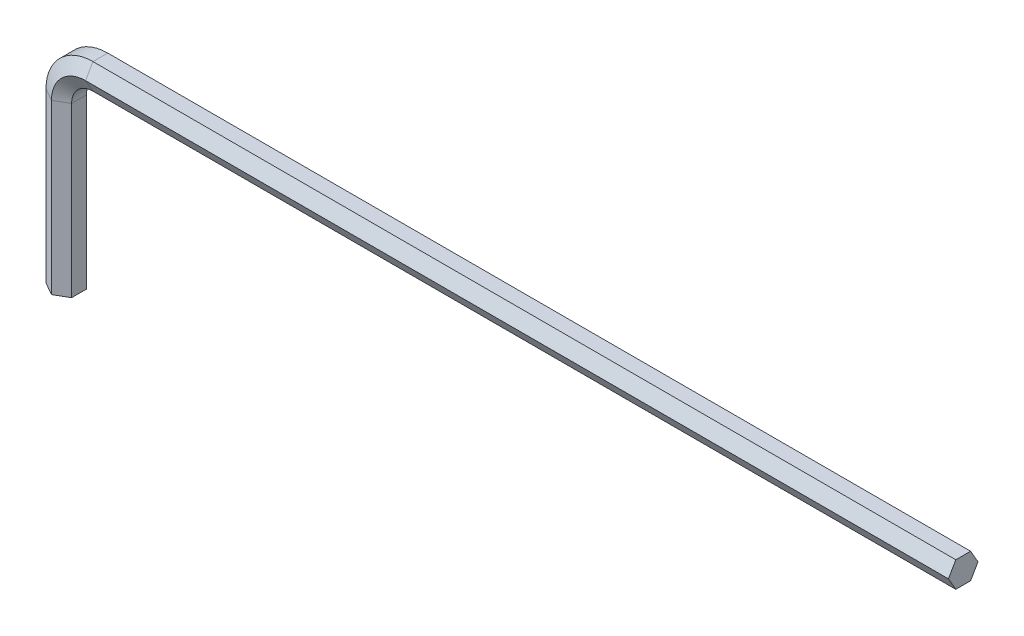
ISO-10303-21;
HEADER;
FILE_DESCRIPTION(('STEP AP214'),'2;1');
FILE_NAME('part.step','',(''),(''),'','','');
FILE_SCHEMA(('AUTOMOTIVE_DESIGN { 1 0 10303 214 1 1 1 1 }'));
ENDSEC;
DATA;
#1=APPLICATION_CONTEXT('core data for automotive mechanical design processes');
#2=APPLICATION_PROTOCOL_DEFINITION('international standard','automotive_design',2000,#1);
#3=PRODUCT_CONTEXT('',#1,'mechanical');
#4=PRODUCT('Part','Part','',(#3));
#5=PRODUCT_RELATED_PRODUCT_CATEGORY('part','',(#4));
#6=PRODUCT_DEFINITION_FORMATION('','',#4);
#7=PRODUCT_DEFINITION_CONTEXT('part definition',#1,'design');
#8=PRODUCT_DEFINITION('design','',#6,#7);
#9=PRODUCT_DEFINITION_SHAPE('','',#8);
#10=(LENGTH_UNIT() NAMED_UNIT(*) SI_UNIT(.MILLI.,.METRE.));
#11=(NAMED_UNIT(*) PLANE_ANGLE_UNIT() SI_UNIT($,.RADIAN.));
#12=(NAMED_UNIT(*) SI_UNIT($,.STERADIAN.) SOLID_ANGLE_UNIT());
#13=UNCERTAINTY_MEASURE_WITH_UNIT(LENGTH_MEASURE(1.E-05),#10,'distance_accuracy_value','');
#14=(GEOMETRIC_REPRESENTATION_CONTEXT(3) GLOBAL_UNCERTAINTY_ASSIGNED_CONTEXT((#13)) GLOBAL_UNIT_ASSIGNED_CONTEXT((#10,
#11,#12)) REPRESENTATION_CONTEXT('',''));
#15=CARTESIAN_POINT('',(0.,0.,0.));
#16=DIRECTION('',(0.,0.,1.));
#17=DIRECTION('',(1.,0.,0.));
#18=AXIS2_PLACEMENT_3D('',#15,#16,#17);
#19=CARTESIAN_POINT('',(105.06,0.,0.));
#20=DIRECTION('',(-1.,0.,0.));
#21=DIRECTION('',(0.,0.,1.));
#22=AXIS2_PLACEMENT_3D('',#19,#20,#21);
#23=PLANE('',#22);
#24=DIRECTION('',(0.,0.,-1.));
#25=VECTOR('',#24,1.);
#26=CARTESIAN_POINT('',(105.06,1.5,0.86602540378444));
#27=LINE('',#26,#25);
#28=CARTESIAN_POINT('',(105.06,1.5,0.86602540378444));
#29=VERTEX_POINT('',#28);
#30=CARTESIAN_POINT('',(105.06,1.5,-0.866025403784439));
#31=VERTEX_POINT('',#30);
#32=EDGE_CURVE('E10',#29,#31,#27,.T.);
#33=ORIENTED_EDGE('',*,*,#32,.F.);
#34=DIRECTION('',(0.,0.866025403784439,-0.5));
#35=VECTOR('',#34,1.);
#36=CARTESIAN_POINT('',(105.06,0.,1.73205080756888));
#37=LINE('',#36,#35);
#38=CARTESIAN_POINT('',(105.06,0.,1.73205080756888));
#39=VERTEX_POINT('',#38);
#40=EDGE_CURVE('E260',#39,#29,#37,.T.);
#41=ORIENTED_EDGE('',*,*,#40,.F.);
#42=DIRECTION('',(0.,0.866025403784439,0.5));
#43=VECTOR('',#42,1.);
#44=CARTESIAN_POINT('',(105.06,-1.5,0.866025403784439));
#45=LINE('',#44,#43);
#46=CARTESIAN_POINT('',(105.06,-1.5,0.866025403784439));
#47=VERTEX_POINT('',#46);
#48=EDGE_CURVE('E245',#47,#39,#45,.T.);
#49=ORIENTED_EDGE('',*,*,#48,.F.);
#50=DIRECTION('',(0.,0.,1.));
#51=VECTOR('',#50,1.);
#52=CARTESIAN_POINT('',(105.06,-1.5,-0.866025403784439));
#53=LINE('',#52,#51);
#54=CARTESIAN_POINT('',(105.06,-1.5,-0.866025403784439));
#55=VERTEX_POINT('',#54);
#56=EDGE_CURVE('E275',#55,#47,#53,.T.);
#57=ORIENTED_EDGE('',*,*,#56,.F.);
#58=DIRECTION('',(0.,-0.866025403784439,0.5));
#59=VECTOR('',#58,1.);
#60=CARTESIAN_POINT('',(105.06,0.,-1.73205080756887));
#61=LINE('',#60,#59);
#62=CARTESIAN_POINT('',(105.06,0.,-1.73205080756887));
#63=VERTEX_POINT('',#62);
#64=EDGE_CURVE('E281',#63,#55,#61,.T.);
#65=ORIENTED_EDGE('',*,*,#64,.F.);
#66=DIRECTION('',(0.,-0.866025403784439,-0.5));
#67=VECTOR('',#66,1.);
#68=CARTESIAN_POINT('',(105.06,1.5,-0.866025403784439));
#69=LINE('',#68,#67);
#70=EDGE_CURVE('E24',#31,#63,#69,.T.);
#71=ORIENTED_EDGE('',*,*,#70,.F.);
#72=EDGE_LOOP('',(#33,#41,#49,#57,#65,#71));
#73=FACE_BOUND('',#72,.T.);
#74=ADVANCED_FACE('F16',(#73),#23,.F.);
#75=CARTESIAN_POINT('',(0.,-23.7,0.));
#76=DIRECTION('',(0.,-1.,0.));
#77=DIRECTION('',(0.,0.,-1.));
#78=AXIS2_PLACEMENT_3D('',#75,#76,#77);
#79=PLANE('',#78);
#80=DIRECTION('',(0.,0.,-1.));
#81=VECTOR('',#80,1.);
#82=CARTESIAN_POINT('',(-1.5,-23.7,0.86602540378444));
#83=LINE('',#82,#81);
#84=CARTESIAN_POINT('',(-1.5,-23.7,0.86602540378444));
#85=VERTEX_POINT('',#84);
#86=CARTESIAN_POINT('',(-1.5,-23.7,-0.866025403784439));
#87=VERTEX_POINT('',#86);
#88=EDGE_CURVE('E213',#85,#87,#83,.T.);
#89=ORIENTED_EDGE('',*,*,#88,.T.);
#90=DIRECTION('',(0.866025403784439,0.,-0.5));
#91=VECTOR('',#90,1.);
#92=CARTESIAN_POINT('',(-1.5,-23.7,-0.866025403784439));
#93=LINE('',#92,#91);
#94=CARTESIAN_POINT('',(0.,-23.7,-1.73205080756887));
#95=VERTEX_POINT('',#94);
#96=EDGE_CURVE('E177',#87,#95,#93,.T.);
#97=ORIENTED_EDGE('',*,*,#96,.T.);
#98=DIRECTION('',(0.866025403784439,0.,0.5));
#99=VECTOR('',#98,1.);
#100=CARTESIAN_POINT('',(0.,-23.7,-1.73205080756887));
#101=LINE('',#100,#99);
#102=CARTESIAN_POINT('',(1.5,-23.7,-0.866025403784439));
#103=VERTEX_POINT('',#102);
#104=EDGE_CURVE('E186',#95,#103,#101,.T.);
#105=ORIENTED_EDGE('',*,*,#104,.T.);
#106=DIRECTION('',(0.,0.,1.));
#107=VECTOR('',#106,1.);
#108=CARTESIAN_POINT('',(1.5,-23.7,-0.866025403784439));
#109=LINE('',#108,#107);
#110=CARTESIAN_POINT('',(1.5,-23.7,0.866025403784439));
#111=VERTEX_POINT('',#110);
#112=EDGE_CURVE('E141',#103,#111,#109,.T.);
#113=ORIENTED_EDGE('',*,*,#112,.T.);
#114=DIRECTION('',(-0.866025403784439,0.,0.5));
#115=VECTOR('',#114,1.);
#116=CARTESIAN_POINT('',(1.5,-23.7,0.866025403784439));
#117=LINE('',#116,#115);
#118=CARTESIAN_POINT('',(0.,-23.7,1.73205080756888));
#119=VERTEX_POINT('',#118);
#120=EDGE_CURVE('E135',#111,#119,#117,.T.);
#121=ORIENTED_EDGE('',*,*,#120,.T.);
#122=DIRECTION('',(-0.866025403784439,0.,-0.5));
#123=VECTOR('',#122,1.);
#124=CARTESIAN_POINT('',(0.,-23.7,1.73205080756888));
#125=LINE('',#124,#123);
#126=EDGE_CURVE('E139',#119,#85,#125,.T.);
#127=ORIENTED_EDGE('',*,*,#126,.T.);
#128=EDGE_LOOP('',(#89,#97,#105,#113,#121,#127));
#129=FACE_BOUND('',#128,.T.);
#130=ADVANCED_FACE('F137',(#129),#79,.T.);
#131=CARTESIAN_POINT('',(105.06,1.5,0.86602540378444));
#132=DIRECTION('',(0.,1.,0.));
#133=DIRECTION('',(0.,0.,-1.));
#134=AXIS2_PLACEMENT_3D('',#131,#132,#133);
#135=PLANE('',#134);
#136=DIRECTION('',(-1.,0.,0.));
#137=VECTOR('',#136,1.);
#138=CARTESIAN_POINT('',(105.06,1.5,-0.866025403784439));
#139=LINE('',#138,#137);
#140=CARTESIAN_POINT('',(4.,1.5,-0.866025403784439));
#141=VERTEX_POINT('',#140);
#142=EDGE_CURVE('E284',#31,#141,#139,.T.);
#143=ORIENTED_EDGE('',*,*,#142,.T.);
#144=DIRECTION('',(0.,0.,-1.));
#145=VECTOR('',#144,1.);
#146=CARTESIAN_POINT('',(4.,1.5,0.86602540378444));
#147=LINE('',#146,#145);
#148=CARTESIAN_POINT('',(4.,1.5,0.86602540378444));
#149=VERTEX_POINT('',#148);
#150=EDGE_CURVE('E257',#149,#141,#147,.T.);
#151=ORIENTED_EDGE('',*,*,#150,.F.);
#152=DIRECTION('',(-1.,0.,0.));
#153=VECTOR('',#152,1.);
#154=CARTESIAN_POINT('',(105.06,1.5,0.86602540378444));
#155=LINE('',#154,#153);
#156=EDGE_CURVE('E246',#29,#149,#155,.T.);
#157=ORIENTED_EDGE('',*,*,#156,.F.);
#158=ORIENTED_EDGE('',*,*,#32,.T.);
#159=EDGE_LOOP('',(#143,#151,#157,#158));
#160=FACE_BOUND('',#159,.T.);
#161=ADVANCED_FACE('F667',(#160),#135,.T.);
#162=CARTESIAN_POINT('',(105.06,1.5,-0.866025403784439));
#163=DIRECTION('',(0.,0.5,-0.866025403784439));
#164=DIRECTION('',(-1.,0.,0.));
#165=AXIS2_PLACEMENT_3D('',#162,#163,#164);
#166=PLANE('',#165);
#167=DIRECTION('',(-1.,0.,0.));
#168=VECTOR('',#167,1.);
#169=CARTESIAN_POINT('',(105.06,0.,-1.73205080756887));
#170=LINE('',#169,#168);
#171=CARTESIAN_POINT('',(4.,0.,-1.73205080756887));
#172=VERTEX_POINT('',#171);
#173=EDGE_CURVE('E278',#63,#172,#170,.T.);
#174=ORIENTED_EDGE('',*,*,#173,.T.);
#175=DIRECTION('',(0.,-0.866025403784439,-0.5));
#176=VECTOR('',#175,1.);
#177=CARTESIAN_POINT('',(4.,1.5,-0.866025403784439));
#178=LINE('',#177,#176);
#179=EDGE_CURVE('E253',#141,#172,#178,.T.);
#180=ORIENTED_EDGE('',*,*,#179,.F.);
#181=ORIENTED_EDGE('',*,*,#142,.F.);
#182=ORIENTED_EDGE('',*,*,#70,.T.);
#183=EDGE_LOOP('',(#174,#180,#181,#182));
#184=FACE_BOUND('',#183,.T.);
#185=ADVANCED_FACE('F677',(#184),#166,.T.);
#186=CARTESIAN_POINT('',(105.06,0.,-1.73205080756887));
#187=DIRECTION('',(0.,-0.5,-0.866025403784439));
#188=DIRECTION('',(0.,-0.866025403784439,0.5));
#189=AXIS2_PLACEMENT_3D('',#186,#187,#188);
#190=PLANE('',#189);
#191=DIRECTION('',(-1.,0.,0.));
#192=VECTOR('',#191,1.);
#193=CARTESIAN_POINT('',(105.06,-1.5,-0.866025403784439));
#194=LINE('',#193,#192);
#195=CARTESIAN_POINT('',(4.,-1.5,-0.866025403784439));
#196=VERTEX_POINT('',#195);
#197=EDGE_CURVE('E272',#55,#196,#194,.T.);
#198=ORIENTED_EDGE('',*,*,#197,.T.);
#199=DIRECTION('',(0.,-0.866025403784439,0.5));
#200=VECTOR('',#199,1.);
#201=CARTESIAN_POINT('',(4.,0.,-1.73205080756887));
#202=LINE('',#201,#200);
#203=EDGE_CURVE('E241',#172,#196,#202,.T.);
#204=ORIENTED_EDGE('',*,*,#203,.F.);
#205=ORIENTED_EDGE('',*,*,#173,.F.);
#206=ORIENTED_EDGE('',*,*,#64,.T.);
#207=EDGE_LOOP('',(#198,#204,#205,#206));
#208=FACE_BOUND('',#207,.T.);
#209=ADVANCED_FACE('F542',(#208),#190,.T.);
#210=CARTESIAN_POINT('',(105.06,-1.5,-0.866025403784439));
#211=DIRECTION('',(0.,-1.,0.));
#212=DIRECTION('',(0.,0.,-1.));
#213=AXIS2_PLACEMENT_3D('',#210,#211,#212);
#214=PLANE('',#213);
#215=DIRECTION('',(-1.,0.,0.));
#216=VECTOR('',#215,1.);
#217=CARTESIAN_POINT('',(105.06,-1.5,0.866025403784439));
#218=LINE('',#217,#216);
#219=CARTESIAN_POINT('',(4.,-1.5,0.866025403784439));
#220=VERTEX_POINT('',#219);
#221=EDGE_CURVE('E242',#47,#220,#218,.T.);
#222=ORIENTED_EDGE('',*,*,#221,.T.);
#223=DIRECTION('',(0.,0.,1.));
#224=VECTOR('',#223,1.);
#225=CARTESIAN_POINT('',(4.,-1.5,-0.866025403784439));
#226=LINE('',#225,#224);
#227=EDGE_CURVE('E171',#196,#220,#226,.T.);
#228=ORIENTED_EDGE('',*,*,#227,.F.);
#229=ORIENTED_EDGE('',*,*,#197,.F.);
#230=ORIENTED_EDGE('',*,*,#56,.T.);
#231=EDGE_LOOP('',(#222,#228,#229,#230));
#232=FACE_BOUND('',#231,.T.);
#233=ADVANCED_FACE('F537',(#232),#214,.T.);
#234=CARTESIAN_POINT('',(105.06,-1.5,0.866025403784439));
#235=DIRECTION('',(0.,-0.5,0.866025403784439));
#236=DIRECTION('',(-1.,0.,0.));
#237=AXIS2_PLACEMENT_3D('',#234,#235,#236);
#238=PLANE('',#237);
#239=DIRECTION('',(-1.,0.,0.));
#240=VECTOR('',#239,1.);
#241=CARTESIAN_POINT('',(105.06,0.,1.73205080756888));
#242=LINE('',#241,#240);
#243=CARTESIAN_POINT('',(4.,0.,1.73205080756888));
#244=VERTEX_POINT('',#243);
#245=EDGE_CURVE('E264',#39,#244,#242,.T.);
#246=ORIENTED_EDGE('',*,*,#245,.T.);
#247=DIRECTION('',(0.,0.866025403784439,0.5));
#248=VECTOR('',#247,1.);
#249=CARTESIAN_POINT('',(4.,-1.5,0.866025403784439));
#250=LINE('',#249,#248);
#251=EDGE_CURVE('E231',#220,#244,#250,.T.);
#252=ORIENTED_EDGE('',*,*,#251,.F.);
#253=ORIENTED_EDGE('',*,*,#221,.F.);
#254=ORIENTED_EDGE('',*,*,#48,.T.);
#255=EDGE_LOOP('',(#246,#252,#253,#254));
#256=FACE_BOUND('',#255,.T.);
#257=ADVANCED_FACE('F541',(#256),#238,.T.);
#258=CARTESIAN_POINT('',(105.06,0.,1.73205080756888));
#259=DIRECTION('',(0.,0.5,0.866025403784439));
#260=DIRECTION('',(1.,0.,0.));
#261=AXIS2_PLACEMENT_3D('',#258,#259,#260);
#262=PLANE('',#261);
#263=DIRECTION('',(0.,0.866025403784439,-0.5));
#264=VECTOR('',#263,1.);
#265=CARTESIAN_POINT('',(4.,0.,1.73205080756888));
#266=LINE('',#265,#264);
#267=EDGE_CURVE('E221',#244,#149,#266,.T.);
#268=ORIENTED_EDGE('',*,*,#267,.F.);
#269=ORIENTED_EDGE('',*,*,#245,.F.);
#270=ORIENTED_EDGE('',*,*,#40,.T.);
#271=ORIENTED_EDGE('',*,*,#156,.T.);
#272=EDGE_LOOP('',(#268,#269,#270,#271));
#273=FACE_BOUND('',#272,.T.);
#274=ADVANCED_FACE('F576',(#273),#262,.T.);
#275=CARTESIAN_POINT('',(4.,-4.,0.));
#276=DIRECTION('',(0.,0.,1.));
#277=DIRECTION('',(1.,0.,0.));
#278=AXIS2_PLACEMENT_3D('',#275,#276,#277);
#279=CYLINDRICAL_SURFACE('',#278,5.5);
#280=CARTESIAN_POINT('',(4.,-4.,-0.866025403784439));
#281=DIRECTION('',(0.,0.,1.));
#282=DIRECTION('',(0.,1.,0.));
#283=AXIS2_PLACEMENT_3D('',#280,#281,#282);
#284=CIRCLE('',#283,5.5);
#285=CARTESIAN_POINT('',(-1.5,-4.,-0.866025403784439));
#286=VERTEX_POINT('',#285);
#287=EDGE_CURVE('E250',#141,#286,#284,.T.);
#288=ORIENTED_EDGE('',*,*,#287,.T.);
#289=DIRECTION('',(0.,0.,-1.));
#290=VECTOR('',#289,1.);
#291=CARTESIAN_POINT('',(-1.50000000000015,-4.,0.86602540378444));
#292=LINE('',#291,#290);
#293=CARTESIAN_POINT('',(-1.5,-4.,0.86602540378444));
#294=VERTEX_POINT('',#293);
#295=EDGE_CURVE('E208',#294,#286,#292,.T.);
#296=ORIENTED_EDGE('',*,*,#295,.F.);
#297=CARTESIAN_POINT('',(4.,-4.,0.86602540378444));
#298=DIRECTION('',(0.,0.,1.));
#299=DIRECTION('',(0.,1.,0.));
#300=AXIS2_PLACEMENT_3D('',#297,#298,#299);
#301=CIRCLE('',#300,5.5);
#302=EDGE_CURVE('E225',#149,#294,#301,.T.);
#303=ORIENTED_EDGE('',*,*,#302,.F.);
#304=ORIENTED_EDGE('',*,*,#150,.T.);
#305=EDGE_LOOP('',(#288,#296,#303,#304));
#306=FACE_BOUND('',#305,.T.);
#307=ADVANCED_FACE('F571',(#306),#279,.T.);
#308=CARTESIAN_POINT('',(4.,-4.,-0.866025403784439));
#309=DIRECTION('',(0.,0.,1.));
#310=DIRECTION('',(1.,0.,0.));
#311=AXIS2_PLACEMENT_3D('',#308,#309,#310);
#312=CONICAL_SURFACE('',#311,5.5,1.0471975511966);
#313=CARTESIAN_POINT('',(4.,-4.,-1.73205080756887));
#314=DIRECTION('',(0.,0.,1.));
#315=DIRECTION('',(0.,1.,0.));
#316=AXIS2_PLACEMENT_3D('',#313,#314,#315);
#317=CIRCLE('',#316,4.);
#318=CARTESIAN_POINT('',(0.,-4.,-1.73205080756887));
#319=VERTEX_POINT('',#318);
#320=EDGE_CURVE('E238',#172,#319,#317,.T.);
#321=ORIENTED_EDGE('',*,*,#320,.T.);
#322=DIRECTION('',(0.866025403784439,0.,-0.5));
#323=VECTOR('',#322,1.);
#324=CARTESIAN_POINT('',(-1.50000000000015,-4.,-0.866025403784439));
#325=LINE('',#324,#323);
#326=EDGE_CURVE('E200',#286,#319,#325,.T.);
#327=ORIENTED_EDGE('',*,*,#326,.F.);
#328=ORIENTED_EDGE('',*,*,#287,.F.);
#329=ORIENTED_EDGE('',*,*,#179,.T.);
#330=EDGE_LOOP('',(#321,#327,#328,#329));
#331=FACE_BOUND('',#330,.T.);
#332=ADVANCED_FACE('F575',(#331),#312,.T.);
#333=CARTESIAN_POINT('',(4.,-4.,-1.73205080756887));
#334=DIRECTION('',(0.,0.,-1.));
#335=DIRECTION('',(-1.,0.,0.));
#336=AXIS2_PLACEMENT_3D('',#333,#334,#335);
#337=CONICAL_SURFACE('',#336,4.,1.0471975511966);
#338=CARTESIAN_POINT('',(4.,-4.,-0.866025403784439));
#339=DIRECTION('',(0.,0.,1.));
#340=DIRECTION('',(0.,1.,0.));
#341=AXIS2_PLACEMENT_3D('',#338,#339,#340);
#342=CIRCLE('',#341,2.5);
#343=CARTESIAN_POINT('',(1.5,-4.,-0.866025403784439));
#344=VERTEX_POINT('',#343);
#345=EDGE_CURVE('E235',#196,#344,#342,.T.);
#346=ORIENTED_EDGE('',*,*,#345,.T.);
#347=DIRECTION('',(0.866025403784439,0.,0.5));
#348=VECTOR('',#347,1.);
#349=CARTESIAN_POINT('',(-1.51726498659895E-13,-4.,-1.73205080756887));
#350=LINE('',#349,#348);
#351=EDGE_CURVE('E173',#319,#344,#350,.T.);
#352=ORIENTED_EDGE('',*,*,#351,.F.);
#353=ORIENTED_EDGE('',*,*,#320,.F.);
#354=ORIENTED_EDGE('',*,*,#203,.T.);
#355=EDGE_LOOP('',(#346,#352,#353,#354));
#356=FACE_BOUND('',#355,.T.);
#357=ADVANCED_FACE('F507',(#356),#337,.F.);
#358=CARTESIAN_POINT('',(4.,-4.,0.));
#359=DIRECTION('',(0.,0.,1.));
#360=DIRECTION('',(1.,0.,0.));
#361=AXIS2_PLACEMENT_3D('',#358,#359,#360);
#362=CYLINDRICAL_SURFACE('',#361,2.5);
#363=CARTESIAN_POINT('',(4.,-4.,0.866025403784439));
#364=DIRECTION('',(0.,0.,1.));
#365=DIRECTION('',(0.,1.,0.));
#366=AXIS2_PLACEMENT_3D('',#363,#364,#365);
#367=CIRCLE('',#366,2.5);
#368=CARTESIAN_POINT('',(1.5,-4.,0.866025403784439));
#369=VERTEX_POINT('',#368);
#370=EDGE_CURVE('E228',#220,#369,#367,.T.);
#371=ORIENTED_EDGE('',*,*,#370,.T.);
#372=DIRECTION('',(0.,0.,1.));
#373=VECTOR('',#372,1.);
#374=CARTESIAN_POINT('',(1.49999999999985,-4.,-0.866025403784439));
#375=LINE('',#374,#373);
#376=EDGE_CURVE('E182',#344,#369,#375,.T.);
#377=ORIENTED_EDGE('',*,*,#376,.F.);
#378=ORIENTED_EDGE('',*,*,#345,.F.);
#379=ORIENTED_EDGE('',*,*,#227,.T.);
#380=EDGE_LOOP('',(#371,#377,#378,#379));
#381=FACE_BOUND('',#380,.T.);
#382=ADVANCED_FACE('F501',(#381),#362,.F.);
#383=CARTESIAN_POINT('',(4.,-4.,0.866025403784439));
#384=DIRECTION('',(0.,0.,1.));
#385=DIRECTION('',(1.,0.,0.));
#386=AXIS2_PLACEMENT_3D('',#383,#384,#385);
#387=CONICAL_SURFACE('',#386,2.5,1.0471975511966);
#388=CARTESIAN_POINT('',(4.,-4.,1.73205080756888));
#389=DIRECTION('',(0.,0.,1.));
#390=DIRECTION('',(0.,1.,0.));
#391=AXIS2_PLACEMENT_3D('',#388,#389,#390);
#392=CIRCLE('',#391,4.);
#393=CARTESIAN_POINT('',(0.,-4.,1.73205080756888));
#394=VERTEX_POINT('',#393);
#395=EDGE_CURVE('E212',#244,#394,#392,.T.);
#396=ORIENTED_EDGE('',*,*,#395,.T.);
#397=DIRECTION('',(-0.866025403784439,0.,0.5));
#398=VECTOR('',#397,1.);
#399=CARTESIAN_POINT('',(1.49999999999985,-4.,0.866025403784439));
#400=LINE('',#399,#398);
#401=EDGE_CURVE('E154',#369,#394,#400,.T.);
#402=ORIENTED_EDGE('',*,*,#401,.F.);
#403=ORIENTED_EDGE('',*,*,#370,.F.);
#404=ORIENTED_EDGE('',*,*,#251,.T.);
#405=EDGE_LOOP('',(#396,#402,#403,#404));
#406=FACE_BOUND('',#405,.T.);
#407=ADVANCED_FACE('F506',(#406),#387,.F.);
#408=CARTESIAN_POINT('',(4.,-4.,1.73205080756888));
#409=DIRECTION('',(0.,0.,-1.));
#410=DIRECTION('',(-1.,0.,0.));
#411=AXIS2_PLACEMENT_3D('',#408,#409,#410);
#412=CONICAL_SURFACE('',#411,4.,1.0471975511966);
#413=DIRECTION('',(-0.866025403784439,0.,-0.5));
#414=VECTOR('',#413,1.);
#415=CARTESIAN_POINT('',(-1.51401826628082E-13,-4.,1.73205080756888));
#416=LINE('',#415,#414);
#417=EDGE_CURVE('E159',#394,#294,#416,.T.);
#418=ORIENTED_EDGE('',*,*,#417,.F.);
#419=ORIENTED_EDGE('',*,*,#395,.F.);
#420=ORIENTED_EDGE('',*,*,#267,.T.);
#421=ORIENTED_EDGE('',*,*,#302,.T.);
#422=EDGE_LOOP('',(#418,#419,#420,#421));
#423=FACE_BOUND('',#422,.T.);
#424=ADVANCED_FACE('F520',(#423),#412,.T.);
#425=CARTESIAN_POINT('',(-1.5,-4.,0.86602540378444));
#426=DIRECTION('',(-1.,0.,0.));
#427=DIRECTION('',(0.,0.,1.));
#428=AXIS2_PLACEMENT_3D('',#425,#426,#427);
#429=PLANE('',#428);
#430=DIRECTION('',(0.,-1.,0.));
#431=VECTOR('',#430,1.);
#432=CARTESIAN_POINT('',(-1.5,-4.,-0.866025403784439));
#433=LINE('',#432,#431);
#434=EDGE_CURVE('E196',#286,#87,#433,.T.);
#435=ORIENTED_EDGE('',*,*,#434,.T.);
#436=ORIENTED_EDGE('',*,*,#88,.F.);
#437=DIRECTION('',(0.,-1.,0.));
#438=VECTOR('',#437,1.);
#439=CARTESIAN_POINT('',(-1.5,-4.,0.86602540378444));
#440=LINE('',#439,#438);
#441=EDGE_CURVE('E147',#294,#85,#440,.T.);
#442=ORIENTED_EDGE('',*,*,#441,.F.);
#443=ORIENTED_EDGE('',*,*,#295,.T.);
#444=EDGE_LOOP('',(#435,#436,#442,#443));
#445=FACE_BOUND('',#444,.T.);
#446=ADVANCED_FACE('F515',(#445),#429,.T.);
#447=CARTESIAN_POINT('',(-1.5,-4.,-0.866025403784439));
#448=DIRECTION('',(-0.5,0.,-0.866025403784439));
#449=DIRECTION('',(-0.866025403784439,0.,0.5));
#450=AXIS2_PLACEMENT_3D('',#447,#448,#449);
#451=PLANE('',#450);
#452=DIRECTION('',(0.,-1.,0.));
#453=VECTOR('',#452,1.);
#454=CARTESIAN_POINT('',(0.,-4.,-1.73205080756887));
#455=LINE('',#454,#453);
#456=EDGE_CURVE('E178',#319,#95,#455,.T.);
#457=ORIENTED_EDGE('',*,*,#456,.T.);
#458=ORIENTED_EDGE('',*,*,#96,.F.);
#459=ORIENTED_EDGE('',*,*,#434,.F.);
#460=ORIENTED_EDGE('',*,*,#326,.T.);
#461=EDGE_LOOP('',(#457,#458,#459,#460));
#462=FACE_BOUND('',#461,.T.);
#463=ADVANCED_FACE('F519',(#462),#451,.T.);
#464=CARTESIAN_POINT('',(0.,-4.,-1.73205080756887));
#465=DIRECTION('',(0.5,0.,-0.866025403784439));
#466=DIRECTION('',(0.,-1.,0.));
#467=AXIS2_PLACEMENT_3D('',#464,#465,#466);
#468=PLANE('',#467);
#469=DIRECTION('',(0.,-1.,0.));
#470=VECTOR('',#469,1.);
#471=CARTESIAN_POINT('',(1.5,-4.,-0.866025403784439));
#472=LINE('',#471,#470);
#473=EDGE_CURVE('E180',#344,#103,#472,.T.);
#474=ORIENTED_EDGE('',*,*,#473,.T.);
#475=ORIENTED_EDGE('',*,*,#104,.F.);
#476=ORIENTED_EDGE('',*,*,#456,.F.);
#477=ORIENTED_EDGE('',*,*,#351,.T.);
#478=EDGE_LOOP('',(#474,#475,#476,#477));
#479=FACE_BOUND('',#478,.T.);
#480=ADVANCED_FACE('F563',(#479),#468,.T.);
#481=CARTESIAN_POINT('',(1.5,-4.,-0.866025403784439));
#482=DIRECTION('',(1.,0.,0.));
#483=DIRECTION('',(0.,0.,-1.));
#484=AXIS2_PLACEMENT_3D('',#481,#482,#483);
#485=PLANE('',#484);
#486=DIRECTION('',(0.,-1.,0.));
#487=VECTOR('',#486,1.);
#488=CARTESIAN_POINT('',(1.5,-4.,0.866025403784439));
#489=LINE('',#488,#487);
#490=EDGE_CURVE('E146',#369,#111,#489,.T.);
#491=ORIENTED_EDGE('',*,*,#490,.T.);
#492=ORIENTED_EDGE('',*,*,#112,.F.);
#493=ORIENTED_EDGE('',*,*,#473,.F.);
#494=ORIENTED_EDGE('',*,*,#376,.T.);
#495=EDGE_LOOP('',(#491,#492,#493,#494));
#496=FACE_BOUND('',#495,.T.);
#497=ADVANCED_FACE('F553',(#496),#485,.T.);
#498=CARTESIAN_POINT('',(1.5,-4.,0.866025403784439));
#499=DIRECTION('',(0.5,0.,0.866025403784439));
#500=DIRECTION('',(0.,-1.,0.));
#501=AXIS2_PLACEMENT_3D('',#498,#499,#500);
#502=PLANE('',#501);
#503=DIRECTION('',(0.,-1.,0.));
#504=VECTOR('',#503,1.);
#505=CARTESIAN_POINT('',(0.,-4.,1.73205080756888));
#506=LINE('',#505,#504);
#507=EDGE_CURVE('E151',#394,#119,#506,.T.);
#508=ORIENTED_EDGE('',*,*,#507,.T.);
#509=ORIENTED_EDGE('',*,*,#120,.F.);
#510=ORIENTED_EDGE('',*,*,#490,.F.);
#511=ORIENTED_EDGE('',*,*,#401,.T.);
#512=EDGE_LOOP('',(#508,#509,#510,#511));
#513=FACE_BOUND('',#512,.T.);
#514=ADVANCED_FACE('F152',(#513),#502,.T.);
#515=CARTESIAN_POINT('',(0.,-4.,1.73205080756888));
#516=DIRECTION('',(-0.5,0.,0.866025403784439));
#517=DIRECTION('',(0.,1.,0.));
#518=AXIS2_PLACEMENT_3D('',#515,#516,#517);
#519=PLANE('',#518);
#520=ORIENTED_EDGE('',*,*,#126,.F.);
#521=ORIENTED_EDGE('',*,*,#507,.F.);
#522=ORIENTED_EDGE('',*,*,#417,.T.);
#523=ORIENTED_EDGE('',*,*,#441,.T.);
#524=EDGE_LOOP('',(#520,#521,#522,#523));
#525=FACE_BOUND('',#524,.T.);
#526=ADVANCED_FACE('F162',(#525),#519,.T.);
#527=CLOSED_SHELL('',(#74,#130,#161,#185,#209,#233,#257,#274,#307,#332,#357,#382,#407,#424,#446,
#463,#480,#497,#514,#526));
#528=MANIFOLD_SOLID_BREP('B1',#527);
#529=ADVANCED_BREP_SHAPE_REPRESENTATION('',(#18,#528),#14);
#530=SHAPE_DEFINITION_REPRESENTATION(#9,#529);
ENDSEC;
END-ISO-10303-21;
